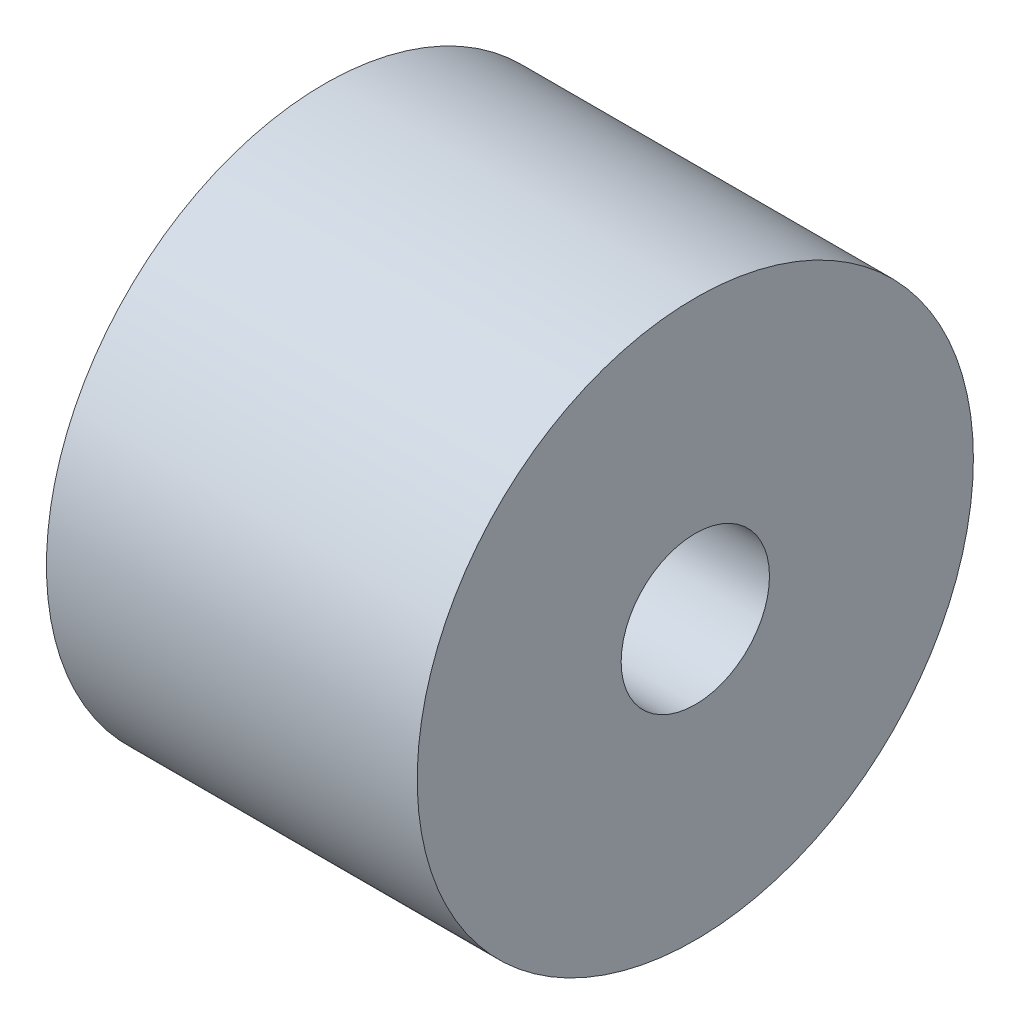
ISO-10303-21;
HEADER;
FILE_DESCRIPTION(('STEP AP214'),'2;1');
FILE_NAME('part.step','',(''),(''),'','','');
FILE_SCHEMA(('AUTOMOTIVE_DESIGN { 1 0 10303 214 1 1 1 1 }'));
ENDSEC;
DATA;
#1=APPLICATION_CONTEXT('core data for automotive mechanical design processes');
#2=APPLICATION_PROTOCOL_DEFINITION('international standard','automotive_design',2000,#1);
#3=PRODUCT_CONTEXT('',#1,'mechanical');
#4=PRODUCT('Part','Part','',(#3));
#5=PRODUCT_RELATED_PRODUCT_CATEGORY('part','',(#4));
#6=PRODUCT_DEFINITION_FORMATION('','',#4);
#7=PRODUCT_DEFINITION_CONTEXT('part definition',#1,'design');
#8=PRODUCT_DEFINITION('design','',#6,#7);
#9=PRODUCT_DEFINITION_SHAPE('','',#8);
#10=(LENGTH_UNIT() NAMED_UNIT(*) SI_UNIT(.MILLI.,.METRE.));
#11=(NAMED_UNIT(*) PLANE_ANGLE_UNIT() SI_UNIT($,.RADIAN.));
#12=(NAMED_UNIT(*) SI_UNIT($,.STERADIAN.) SOLID_ANGLE_UNIT());
#13=UNCERTAINTY_MEASURE_WITH_UNIT(LENGTH_MEASURE(1.E-05),#10,'distance_accuracy_value','');
#14=(GEOMETRIC_REPRESENTATION_CONTEXT(3) GLOBAL_UNCERTAINTY_ASSIGNED_CONTEXT((#13)) GLOBAL_UNIT_ASSIGNED_CONTEXT((#10,
#11,#12)) REPRESENTATION_CONTEXT('',''));
#15=CARTESIAN_POINT('',(0.,0.,0.));
#16=DIRECTION('',(0.,0.,1.));
#17=DIRECTION('',(1.,0.,0.));
#18=AXIS2_PLACEMENT_3D('',#15,#16,#17);
#19=CARTESIAN_POINT('',(20.,-173.602016711993,27.1525576252097));
#20=DIRECTION('',(-1.,0.,0.));
#21=DIRECTION('',(0.,0.,1.));
#22=AXIS2_PLACEMENT_3D('',#19,#20,#21);
#23=CYLINDRICAL_SURFACE('',#22,4.);
#24=CARTESIAN_POINT('',(20.,-173.602016711993,27.1525576252097));
#25=DIRECTION('',(1.,0.,0.));
#26=DIRECTION('',(0.,0.,-1.));
#27=AXIS2_PLACEMENT_3D('',#24,#25,#26);
#28=CIRCLE('',#27,4.);
#29=CARTESIAN_POINT('',(20.,-173.602016711993,23.1525576252097));
#30=VERTEX_POINT('',#29);
#31=EDGE_CURVE('E153',#30,#30,#28,.T.);
#32=ORIENTED_EDGE('',*,*,#31,.T.);
#33=EDGE_LOOP('',(#32));
#34=FACE_BOUND('',#33,.T.);
#35=CARTESIAN_POINT('',(8.,-173.602016711993,27.1525576252097));
#36=DIRECTION('',(-1.,0.,0.));
#37=DIRECTION('',(0.,0.,1.));
#38=AXIS2_PLACEMENT_3D('',#35,#36,#37);
#39=CIRCLE('',#38,4.);
#40=CARTESIAN_POINT('',(8.,-173.602016711993,31.1525576252097));
#41=VERTEX_POINT('',#40);
#42=EDGE_CURVE('E48',#41,#41,#39,.T.);
#43=ORIENTED_EDGE('',*,*,#42,.T.);
#44=EDGE_LOOP('',(#43));
#45=FACE_BOUND('',#44,.T.);
#46=ADVANCED_FACE('F44',(#34,#45),#23,.F.);
#47=CARTESIAN_POINT('',(20.,-173.602016711993,27.1525576252097));
#48=DIRECTION('',(1.,0.,0.));
#49=DIRECTION('',(0.,0.,-1.));
#50=AXIS2_PLACEMENT_3D('',#47,#48,#49);
#51=PLANE('',#50);
#52=CARTESIAN_POINT('',(20.,-173.602016711993,27.1525576252097));
#53=DIRECTION('',(1.,0.,0.));
#54=DIRECTION('',(0.,0.,-1.));
#55=AXIS2_PLACEMENT_3D('',#52,#53,#54);
#56=CIRCLE('',#55,15.);
#57=CARTESIAN_POINT('',(20.,-173.602016711993,12.1525576252097));
#58=VERTEX_POINT('',#57);
#59=EDGE_CURVE('E13',#58,#58,#56,.T.);
#60=ORIENTED_EDGE('',*,*,#59,.T.);
#61=EDGE_LOOP('',(#60));
#62=FACE_BOUND('',#61,.T.);
#63=ORIENTED_EDGE('',*,*,#31,.F.);
#64=EDGE_LOOP('',(#63));
#65=FACE_BOUND('',#64,.T.);
#66=ADVANCED_FACE('F161',(#62,#65),#51,.T.);
#67=CARTESIAN_POINT('',(0.,-173.602016711993,27.1525576252097));
#68=DIRECTION('',(1.,0.,0.));
#69=DIRECTION('',(0.,0.,-1.));
#70=AXIS2_PLACEMENT_3D('',#67,#68,#69);
#71=PLANE('',#70);
#72=DIRECTION('',(0.,-0.262789115876191,0.964853294846947));
#73=VECTOR('',#72,1.);
#74=CARTESIAN_POINT('',(0.,-178.887374244355,21.8235493602097));
#75=LINE('',#74,#73);
#76=CARTESIAN_POINT('',(0.,-178.887374244355,21.8235493602097));
#77=VERTEX_POINT('',#76);
#78=CARTESIAN_POINT('',(0.,-180.859752012641,29.0653073838186));
#79=VERTEX_POINT('',#78);
#80=EDGE_CURVE('E135',#77,#79,#75,.T.);
#81=ORIENTED_EDGE('',*,*,#80,.F.);
#82=DIRECTION('',(0.,-0.966982022200687,0.254844597236571));
#83=VECTOR('',#82,1.);
#84=CARTESIAN_POINT('',(0.,-171.629638943706,19.9107996016008));
#85=LINE('',#84,#83);
#86=CARTESIAN_POINT('',(0.,-171.629638943706,19.9107996016008));
#87=VERTEX_POINT('',#86);
#88=EDGE_CURVE('E61',#87,#77,#85,.T.);
#89=ORIENTED_EDGE('',*,*,#88,.F.);
#90=DIRECTION('',(0.,-0.70419290632444,-0.710008697610345));
#91=VECTOR('',#90,1.);
#92=CARTESIAN_POINT('',(0.,-166.344281411344,25.2398078666008));
#93=LINE('',#92,#91);
#94=CARTESIAN_POINT('',(0.,-166.344281411344,25.2398078666008));
#95=VERTEX_POINT('',#94);
#96=EDGE_CURVE('E144',#95,#87,#93,.T.);
#97=ORIENTED_EDGE('',*,*,#96,.F.);
#98=DIRECTION('',(0.,0.262789115876245,-0.964853294846932));
#99=VECTOR('',#98,1.);
#100=CARTESIAN_POINT('',(0.,-168.316659179631,32.4815658902097));
#101=LINE('',#100,#99);
#102=CARTESIAN_POINT('',(0.,-168.316659179631,32.4815658902097));
#103=VERTEX_POINT('',#102);
#104=EDGE_CURVE('E142',#103,#95,#101,.T.);
#105=ORIENTED_EDGE('',*,*,#104,.F.);
#106=DIRECTION('',(0.,0.966982022200683,-0.254844597236586));
#107=VECTOR('',#106,1.);
#108=CARTESIAN_POINT('',(0.,-175.574394480279,34.3943156488186));
#109=LINE('',#108,#107);
#110=CARTESIAN_POINT('',(0.,-175.574394480279,34.3943156488186));
#111=VERTEX_POINT('',#110);
#112=EDGE_CURVE('E109',#111,#103,#109,.T.);
#113=ORIENTED_EDGE('',*,*,#112,.F.);
#114=DIRECTION('',(0.,0.704192906324437,0.710008697610348));
#115=VECTOR('',#114,1.);
#116=CARTESIAN_POINT('',(0.,-180.859752012641,29.0653073838186));
#117=LINE('',#116,#115);
#118=EDGE_CURVE('E138',#79,#111,#117,.T.);
#119=ORIENTED_EDGE('',*,*,#118,.F.);
#120=EDGE_LOOP('',(#81,#89,#97,#105,#113,#119));
#121=FACE_BOUND('',#120,.T.);
#122=CARTESIAN_POINT('',(0.,-173.602016711993,27.1525576252097));
#123=DIRECTION('',(1.,0.,0.));
#124=DIRECTION('',(0.,0.,-1.));
#125=AXIS2_PLACEMENT_3D('',#122,#123,#124);
#126=CIRCLE('',#125,15.);
#127=CARTESIAN_POINT('',(0.,-173.602016711993,12.1525576252097));
#128=VERTEX_POINT('',#127);
#129=EDGE_CURVE('E53',#128,#128,#126,.T.);
#130=ORIENTED_EDGE('',*,*,#129,.F.);
#131=EDGE_LOOP('',(#130));
#132=FACE_BOUND('',#131,.T.);
#133=ADVANCED_FACE('F159',(#121,#132),#71,.F.);
#134=CARTESIAN_POINT('',(20.,-173.602016711993,27.1525576252097));
#135=DIRECTION('',(-1.,0.,0.));
#136=DIRECTION('',(0.,0.,1.));
#137=AXIS2_PLACEMENT_3D('',#134,#135,#136);
#138=CYLINDRICAL_SURFACE('',#137,15.);
#139=ORIENTED_EDGE('',*,*,#59,.F.);
#140=EDGE_LOOP('',(#139));
#141=FACE_BOUND('',#140,.T.);
#142=ORIENTED_EDGE('',*,*,#129,.T.);
#143=EDGE_LOOP('',(#142));
#144=FACE_BOUND('',#143,.T.);
#145=ADVANCED_FACE('F46',(#141,#144),#138,.T.);
#146=CARTESIAN_POINT('',(8.,-171.629638943706,19.9107996016008));
#147=DIRECTION('',(0.,-0.254844597236571,-0.966982022200687));
#148=DIRECTION('',(0.,0.966982022200687,-0.254844597236571));
#149=AXIS2_PLACEMENT_3D('',#146,#147,#148);
#150=PLANE('',#149);
#151=ORIENTED_EDGE('',*,*,#88,.T.);
#152=DIRECTION('',(-1.,0.,0.));
#153=VECTOR('',#152,1.);
#154=CARTESIAN_POINT('',(8.,-178.887374244355,21.8235493602097));
#155=LINE('',#154,#153);
#156=CARTESIAN_POINT('',(8.,-178.887374244355,21.8235493602097));
#157=VERTEX_POINT('',#156);
#158=EDGE_CURVE('E91',#157,#77,#155,.T.);
#159=ORIENTED_EDGE('',*,*,#158,.F.);
#160=DIRECTION('',(0.,-0.966982022200687,0.254844597236571));
#161=VECTOR('',#160,1.);
#162=CARTESIAN_POINT('',(8.,-171.629638943706,19.9107996016008));
#163=LINE('',#162,#161);
#164=CARTESIAN_POINT('',(8.,-171.629638943706,19.9107996016008));
#165=VERTEX_POINT('',#164);
#166=EDGE_CURVE('E146',#165,#157,#163,.T.);
#167=ORIENTED_EDGE('',*,*,#166,.F.);
#168=DIRECTION('',(-1.,0.,0.));
#169=VECTOR('',#168,1.);
#170=CARTESIAN_POINT('',(8.,-171.629638943706,19.9107996016008));
#171=LINE('',#170,#169);
#172=EDGE_CURVE('E69',#165,#87,#171,.T.);
#173=ORIENTED_EDGE('',*,*,#172,.T.);
#174=EDGE_LOOP('',(#151,#159,#167,#173));
#175=FACE_BOUND('',#174,.T.);
#176=ADVANCED_FACE('F167',(#175),#150,.F.);
#177=CARTESIAN_POINT('',(8.,-166.344281411344,25.2398078666008));
#178=DIRECTION('',(0.,0.710008697610346,-0.70419290632444));
#179=DIRECTION('',(0.,0.70419290632444,0.710008697610346));
#180=AXIS2_PLACEMENT_3D('',#177,#178,#179);
#181=PLANE('',#180);
#182=ORIENTED_EDGE('',*,*,#96,.T.);
#183=ORIENTED_EDGE('',*,*,#172,.F.);
#184=DIRECTION('',(0.,-0.70419290632444,-0.710008697610345));
#185=VECTOR('',#184,1.);
#186=CARTESIAN_POINT('',(8.,-166.344281411344,25.2398078666008));
#187=LINE('',#186,#185);
#188=CARTESIAN_POINT('',(8.,-166.344281411344,25.2398078666008));
#189=VERTEX_POINT('',#188);
#190=EDGE_CURVE('E121',#189,#165,#187,.T.);
#191=ORIENTED_EDGE('',*,*,#190,.F.);
#192=DIRECTION('',(-1.,0.,0.));
#193=VECTOR('',#192,1.);
#194=CARTESIAN_POINT('',(8.,-166.344281411344,25.2398078666008));
#195=LINE('',#194,#193);
#196=EDGE_CURVE('E113',#189,#95,#195,.T.);
#197=ORIENTED_EDGE('',*,*,#196,.T.);
#198=EDGE_LOOP('',(#182,#183,#191,#197));
#199=FACE_BOUND('',#198,.T.);
#200=ADVANCED_FACE('F181',(#199),#181,.F.);
#201=CARTESIAN_POINT('',(8.,-168.316659179631,32.4815658902097));
#202=DIRECTION('',(0.,0.964853294846932,0.262789115876245));
#203=DIRECTION('',(0.,-0.262789115876245,0.964853294846932));
#204=AXIS2_PLACEMENT_3D('',#201,#202,#203);
#205=PLANE('',#204);
#206=ORIENTED_EDGE('',*,*,#104,.T.);
#207=ORIENTED_EDGE('',*,*,#196,.F.);
#208=DIRECTION('',(0.,0.262789115876245,-0.964853294846932));
#209=VECTOR('',#208,1.);
#210=CARTESIAN_POINT('',(8.,-168.316659179631,32.4815658902097));
#211=LINE('',#210,#209);
#212=CARTESIAN_POINT('',(8.,-168.316659179631,32.4815658902097));
#213=VERTEX_POINT('',#212);
#214=EDGE_CURVE('E117',#213,#189,#211,.T.);
#215=ORIENTED_EDGE('',*,*,#214,.F.);
#216=DIRECTION('',(-1.,0.,0.));
#217=VECTOR('',#216,1.);
#218=CARTESIAN_POINT('',(8.,-168.316659179631,32.4815658902097));
#219=LINE('',#218,#217);
#220=EDGE_CURVE('E102',#213,#103,#219,.T.);
#221=ORIENTED_EDGE('',*,*,#220,.T.);
#222=EDGE_LOOP('',(#206,#207,#215,#221));
#223=FACE_BOUND('',#222,.T.);
#224=ADVANCED_FACE('F118',(#223),#205,.F.);
#225=CARTESIAN_POINT('',(8.,-175.574394480279,34.3943156488186));
#226=DIRECTION('',(0.,0.254844597236586,0.966982022200683));
#227=DIRECTION('',(0.,-0.966982022200683,0.254844597236586));
#228=AXIS2_PLACEMENT_3D('',#225,#226,#227);
#229=PLANE('',#228);
#230=ORIENTED_EDGE('',*,*,#112,.T.);
#231=ORIENTED_EDGE('',*,*,#220,.F.);
#232=DIRECTION('',(0.,0.966982022200683,-0.254844597236586));
#233=VECTOR('',#232,1.);
#234=CARTESIAN_POINT('',(8.,-175.574394480279,34.3943156488186));
#235=LINE('',#234,#233);
#236=CARTESIAN_POINT('',(8.,-175.574394480279,34.3943156488186));
#237=VERTEX_POINT('',#236);
#238=EDGE_CURVE('E106',#237,#213,#235,.T.);
#239=ORIENTED_EDGE('',*,*,#238,.F.);
#240=DIRECTION('',(-1.,0.,0.));
#241=VECTOR('',#240,1.);
#242=CARTESIAN_POINT('',(8.,-175.574394480279,34.3943156488186));
#243=LINE('',#242,#241);
#244=EDGE_CURVE('E114',#237,#111,#243,.T.);
#245=ORIENTED_EDGE('',*,*,#244,.T.);
#246=EDGE_LOOP('',(#230,#231,#239,#245));
#247=FACE_BOUND('',#246,.T.);
#248=ADVANCED_FACE('F104',(#247),#229,.F.);
#249=CARTESIAN_POINT('',(8.,-180.859752012641,29.0653073838186));
#250=DIRECTION('',(0.,-0.710008697610348,0.704192906324438));
#251=DIRECTION('',(0.,-0.704192906324437,-0.710008697610348));
#252=AXIS2_PLACEMENT_3D('',#249,#250,#251);
#253=PLANE('',#252);
#254=ORIENTED_EDGE('',*,*,#118,.T.);
#255=ORIENTED_EDGE('',*,*,#244,.F.);
#256=DIRECTION('',(0.,0.704192906324437,0.710008697610348));
#257=VECTOR('',#256,1.);
#258=CARTESIAN_POINT('',(8.,-180.859752012641,29.0653073838186));
#259=LINE('',#258,#257);
#260=CARTESIAN_POINT('',(8.,-180.859752012641,29.0653073838186));
#261=VERTEX_POINT('',#260);
#262=EDGE_CURVE('E127',#261,#237,#259,.T.);
#263=ORIENTED_EDGE('',*,*,#262,.F.);
#264=DIRECTION('',(-1.,0.,0.));
#265=VECTOR('',#264,1.);
#266=CARTESIAN_POINT('',(8.,-180.859752012641,29.0653073838186));
#267=LINE('',#266,#265);
#268=EDGE_CURVE('E150',#261,#79,#267,.T.);
#269=ORIENTED_EDGE('',*,*,#268,.T.);
#270=EDGE_LOOP('',(#254,#255,#263,#269));
#271=FACE_BOUND('',#270,.T.);
#272=ADVANCED_FACE('F185',(#271),#253,.F.);
#273=CARTESIAN_POINT('',(8.,-178.887374244355,21.8235493602097));
#274=DIRECTION('',(0.,-0.964853294846947,-0.262789115876191));
#275=DIRECTION('',(0.,0.262789115876191,-0.964853294846947));
#276=AXIS2_PLACEMENT_3D('',#273,#274,#275);
#277=PLANE('',#276);
#278=ORIENTED_EDGE('',*,*,#80,.T.);
#279=ORIENTED_EDGE('',*,*,#268,.F.);
#280=DIRECTION('',(0.,-0.262789115876191,0.964853294846947));
#281=VECTOR('',#280,1.);
#282=CARTESIAN_POINT('',(8.,-178.887374244355,21.8235493602097));
#283=LINE('',#282,#281);
#284=EDGE_CURVE('E129',#157,#261,#283,.T.);
#285=ORIENTED_EDGE('',*,*,#284,.F.);
#286=ORIENTED_EDGE('',*,*,#158,.T.);
#287=EDGE_LOOP('',(#278,#279,#285,#286));
#288=FACE_BOUND('',#287,.T.);
#289=ADVANCED_FACE('F182',(#288),#277,.F.);
#290=CARTESIAN_POINT('',(8.,0.,0.));
#291=DIRECTION('',(-1.,0.,0.));
#292=DIRECTION('',(0.,0.,1.));
#293=AXIS2_PLACEMENT_3D('',#290,#291,#292);
#294=PLANE('',#293);
#295=ORIENTED_EDGE('',*,*,#42,.F.);
#296=EDGE_LOOP('',(#295));
#297=FACE_BOUND('',#296,.T.);
#298=ORIENTED_EDGE('',*,*,#166,.T.);
#299=ORIENTED_EDGE('',*,*,#284,.T.);
#300=ORIENTED_EDGE('',*,*,#262,.T.);
#301=ORIENTED_EDGE('',*,*,#238,.T.);
#302=ORIENTED_EDGE('',*,*,#214,.T.);
#303=ORIENTED_EDGE('',*,*,#190,.T.);
#304=EDGE_LOOP('',(#298,#299,#300,#301,#302,#303));
#305=FACE_BOUND('',#304,.T.);
#306=ADVANCED_FACE('F124',(#297,#305),#294,.T.);
#307=CLOSED_SHELL('',(#46,#66,#133,#145,#176,#200,#224,#248,#272,#289,#306));
#308=MANIFOLD_SOLID_BREP('B2',#307);
#309=ADVANCED_BREP_SHAPE_REPRESENTATION('',(#18,#308),#14);
#310=SHAPE_DEFINITION_REPRESENTATION(#9,#309);
ENDSEC;
END-ISO-10303-21;
